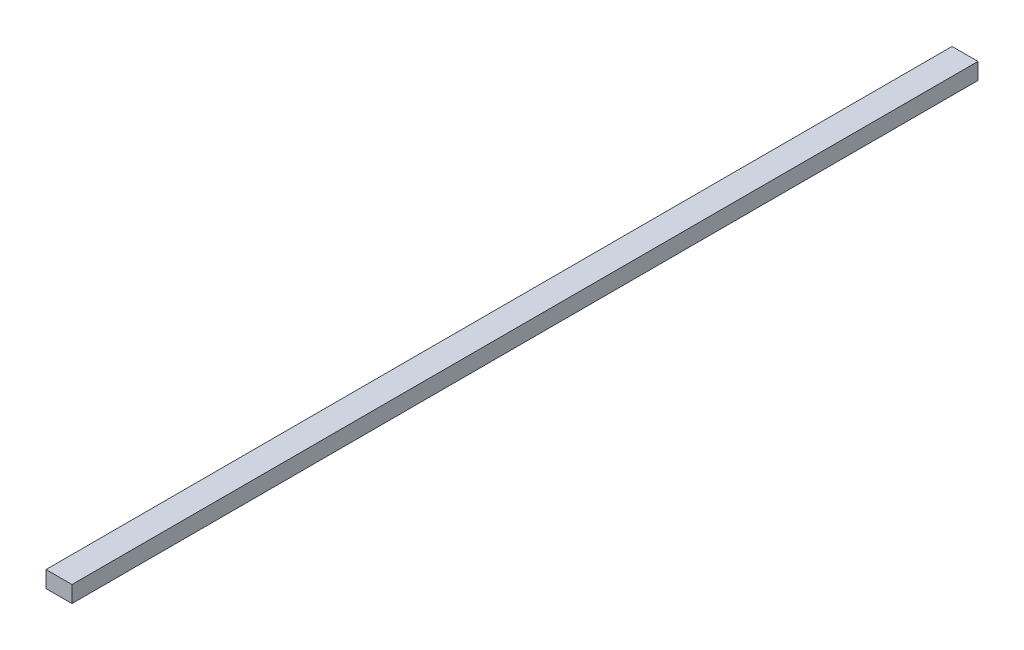
ISO-10303-21;
HEADER;
FILE_DESCRIPTION(('STEP AP214'),'2;1');
FILE_NAME('part.step','',(''),(''),'','','');
FILE_SCHEMA(('AUTOMOTIVE_DESIGN { 1 0 10303 214 1 1 1 1 }'));
ENDSEC;
DATA;
#1=APPLICATION_CONTEXT('core data for automotive mechanical design processes');
#2=APPLICATION_PROTOCOL_DEFINITION('international standard','automotive_design',2000,#1);
#3=PRODUCT_CONTEXT('',#1,'mechanical');
#4=PRODUCT('Part','Part','',(#3));
#5=PRODUCT_RELATED_PRODUCT_CATEGORY('part','',(#4));
#6=PRODUCT_DEFINITION_FORMATION('','',#4);
#7=PRODUCT_DEFINITION_CONTEXT('part definition',#1,'design');
#8=PRODUCT_DEFINITION('design','',#6,#7);
#9=PRODUCT_DEFINITION_SHAPE('','',#8);
#10=(LENGTH_UNIT() NAMED_UNIT(*) SI_UNIT(.MILLI.,.METRE.));
#11=(NAMED_UNIT(*) PLANE_ANGLE_UNIT() SI_UNIT($,.RADIAN.));
#12=(NAMED_UNIT(*) SI_UNIT($,.STERADIAN.) SOLID_ANGLE_UNIT());
#13=UNCERTAINTY_MEASURE_WITH_UNIT(LENGTH_MEASURE(1.E-05),#10,'distance_accuracy_value','');
#14=(GEOMETRIC_REPRESENTATION_CONTEXT(3) GLOBAL_UNCERTAINTY_ASSIGNED_CONTEXT((#13)) GLOBAL_UNIT_ASSIGNED_CONTEXT((#10,
#11,#12)) REPRESENTATION_CONTEXT('',''));
#15=CARTESIAN_POINT('',(0.,0.,0.));
#16=DIRECTION('',(0.,0.,1.));
#17=DIRECTION('',(1.,0.,0.));
#18=AXIS2_PLACEMENT_3D('',#15,#16,#17);
#19=CARTESIAN_POINT('',(69.85,44.45,4876.8));
#20=DIRECTION('',(-1.,0.,0.));
#21=DIRECTION('',(0.,0.,1.));
#22=AXIS2_PLACEMENT_3D('',#19,#20,#21);
#23=PLANE('',#22);
#24=DIRECTION('',(0.,1.,0.));
#25=VECTOR('',#24,1.);
#26=CARTESIAN_POINT('',(69.85,44.45,0.));
#27=LINE('',#26,#25);
#28=CARTESIAN_POINT('',(69.85,-44.45,0.));
#29=VERTEX_POINT('',#28);
#30=CARTESIAN_POINT('',(69.85,44.45,0.));
#31=VERTEX_POINT('',#30);
#32=EDGE_CURVE('E108',#29,#31,#27,.T.);
#33=ORIENTED_EDGE('',*,*,#32,.T.);
#34=DIRECTION('',(0.,0.,-1.));
#35=VECTOR('',#34,1.);
#36=CARTESIAN_POINT('',(69.85,44.45,4876.8));
#37=LINE('',#36,#35);
#38=CARTESIAN_POINT('',(69.85,44.45,4876.8));
#39=VERTEX_POINT('',#38);
#40=EDGE_CURVE('E11',#39,#31,#37,.T.);
#41=ORIENTED_EDGE('',*,*,#40,.F.);
#42=DIRECTION('',(0.,1.,0.));
#43=VECTOR('',#42,1.);
#44=CARTESIAN_POINT('',(69.85,44.45,4876.8));
#45=LINE('',#44,#43);
#46=CARTESIAN_POINT('',(69.85,-44.45,4876.8));
#47=VERTEX_POINT('',#46);
#48=EDGE_CURVE('E96',#47,#39,#45,.T.);
#49=ORIENTED_EDGE('',*,*,#48,.F.);
#50=DIRECTION('',(0.,0.,-1.));
#51=VECTOR('',#50,1.);
#52=CARTESIAN_POINT('',(69.85,-44.45,4876.8));
#53=LINE('',#52,#51);
#54=EDGE_CURVE('E104',#47,#29,#53,.T.);
#55=ORIENTED_EDGE('',*,*,#54,.T.);
#56=EDGE_LOOP('',(#33,#41,#49,#55));
#57=FACE_BOUND('',#56,.T.);
#58=ADVANCED_FACE('F43',(#57),#23,.F.);
#59=CARTESIAN_POINT('',(-69.85,44.45,4876.8));
#60=DIRECTION('',(0.,-1.,0.));
#61=DIRECTION('',(0.,0.,-1.));
#62=AXIS2_PLACEMENT_3D('',#59,#60,#61);
#63=PLANE('',#62);
#64=DIRECTION('',(-1.,0.,0.));
#65=VECTOR('',#64,1.);
#66=CARTESIAN_POINT('',(-69.85,44.45,0.));
#67=LINE('',#66,#65);
#68=CARTESIAN_POINT('',(-69.85,44.45,0.));
#69=VERTEX_POINT('',#68);
#70=EDGE_CURVE('E100',#31,#69,#67,.T.);
#71=ORIENTED_EDGE('',*,*,#70,.T.);
#72=DIRECTION('',(0.,0.,-1.));
#73=VECTOR('',#72,1.);
#74=CARTESIAN_POINT('',(-69.85,44.45,4876.8));
#75=LINE('',#74,#73);
#76=CARTESIAN_POINT('',(-69.85,44.45,4876.8));
#77=VERTEX_POINT('',#76);
#78=EDGE_CURVE('E52',#77,#69,#75,.T.);
#79=ORIENTED_EDGE('',*,*,#78,.F.);
#80=DIRECTION('',(-1.,0.,0.));
#81=VECTOR('',#80,1.);
#82=CARTESIAN_POINT('',(-69.85,44.45,4876.8));
#83=LINE('',#82,#81);
#84=EDGE_CURVE('E91',#39,#77,#83,.T.);
#85=ORIENTED_EDGE('',*,*,#84,.F.);
#86=ORIENTED_EDGE('',*,*,#40,.T.);
#87=EDGE_LOOP('',(#71,#79,#85,#86));
#88=FACE_BOUND('',#87,.T.);
#89=ADVANCED_FACE('F99',(#88),#63,.F.);
#90=CARTESIAN_POINT('',(-69.85,44.45,4876.8));
#91=DIRECTION('',(1.,0.,0.));
#92=DIRECTION('',(0.,1.,0.));
#93=AXIS2_PLACEMENT_3D('',#90,#91,#92);
#94=PLANE('',#93);
#95=DIRECTION('',(0.,-1.,0.));
#96=VECTOR('',#95,1.);
#97=CARTESIAN_POINT('',(-69.85,44.45,0.));
#98=LINE('',#97,#96);
#99=CARTESIAN_POINT('',(-69.85,-44.45,0.));
#100=VERTEX_POINT('',#99);
#101=EDGE_CURVE('E78',#69,#100,#98,.T.);
#102=ORIENTED_EDGE('',*,*,#101,.T.);
#103=DIRECTION('',(0.,0.,-1.));
#104=VECTOR('',#103,1.);
#105=CARTESIAN_POINT('',(-69.85,-44.45,4876.8));
#106=LINE('',#105,#104);
#107=CARTESIAN_POINT('',(-69.85,-44.45,4876.8));
#108=VERTEX_POINT('',#107);
#109=EDGE_CURVE('E101',#108,#100,#106,.T.);
#110=ORIENTED_EDGE('',*,*,#109,.F.);
#111=DIRECTION('',(0.,-1.,0.));
#112=VECTOR('',#111,1.);
#113=CARTESIAN_POINT('',(-69.85,44.45,4876.8));
#114=LINE('',#113,#112);
#115=EDGE_CURVE('E94',#77,#108,#114,.T.);
#116=ORIENTED_EDGE('',*,*,#115,.F.);
#117=ORIENTED_EDGE('',*,*,#78,.T.);
#118=EDGE_LOOP('',(#102,#110,#116,#117));
#119=FACE_BOUND('',#118,.T.);
#120=ADVANCED_FACE('F102',(#119),#94,.F.);
#121=CARTESIAN_POINT('',(-69.85,-44.45,4876.8));
#122=DIRECTION('',(0.,1.,0.));
#123=DIRECTION('',(0.,0.,1.));
#124=AXIS2_PLACEMENT_3D('',#121,#122,#123);
#125=PLANE('',#124);
#126=DIRECTION('',(1.,0.,0.));
#127=VECTOR('',#126,1.);
#128=CARTESIAN_POINT('',(-69.85,-44.45,0.));
#129=LINE('',#128,#127);
#130=EDGE_CURVE('E84',#100,#29,#129,.T.);
#131=ORIENTED_EDGE('',*,*,#130,.T.);
#132=ORIENTED_EDGE('',*,*,#54,.F.);
#133=DIRECTION('',(1.,0.,0.));
#134=VECTOR('',#133,1.);
#135=CARTESIAN_POINT('',(-69.85,-44.45,4876.8));
#136=LINE('',#135,#134);
#137=EDGE_CURVE('E60',#108,#47,#136,.T.);
#138=ORIENTED_EDGE('',*,*,#137,.F.);
#139=ORIENTED_EDGE('',*,*,#109,.T.);
#140=EDGE_LOOP('',(#131,#132,#138,#139));
#141=FACE_BOUND('',#140,.T.);
#142=ADVANCED_FACE('F118',(#141),#125,.F.);
#143=CARTESIAN_POINT('',(0.,0.,4876.8));
#144=DIRECTION('',(0.,0.,1.));
#145=DIRECTION('',(1.,0.,0.));
#146=AXIS2_PLACEMENT_3D('',#143,#144,#145);
#147=PLANE('',#146);
#148=ORIENTED_EDGE('',*,*,#48,.T.);
#149=ORIENTED_EDGE('',*,*,#84,.T.);
#150=ORIENTED_EDGE('',*,*,#115,.T.);
#151=ORIENTED_EDGE('',*,*,#137,.T.);
#152=EDGE_LOOP('',(#148,#149,#150,#151));
#153=FACE_BOUND('',#152,.T.);
#154=ADVANCED_FACE('F92',(#153),#147,.T.);
#155=CARTESIAN_POINT('',(0.,0.,0.));
#156=DIRECTION('',(0.,0.,1.));
#157=DIRECTION('',(1.,0.,0.));
#158=AXIS2_PLACEMENT_3D('',#155,#156,#157);
#159=PLANE('',#158);
#160=ORIENTED_EDGE('',*,*,#32,.F.);
#161=ORIENTED_EDGE('',*,*,#130,.F.);
#162=ORIENTED_EDGE('',*,*,#101,.F.);
#163=ORIENTED_EDGE('',*,*,#70,.F.);
#164=EDGE_LOOP('',(#160,#161,#162,#163));
#165=FACE_BOUND('',#164,.T.);
#166=ADVANCED_FACE('F121',(#165),#159,.F.);
#167=CLOSED_SHELL('',(#58,#89,#120,#142,#154,#166));
#168=MANIFOLD_SOLID_BREP('B2',#167);
#169=ADVANCED_BREP_SHAPE_REPRESENTATION('',(#18,#168),#14);
#170=SHAPE_DEFINITION_REPRESENTATION(#9,#169);
ENDSEC;
END-ISO-10303-21;
